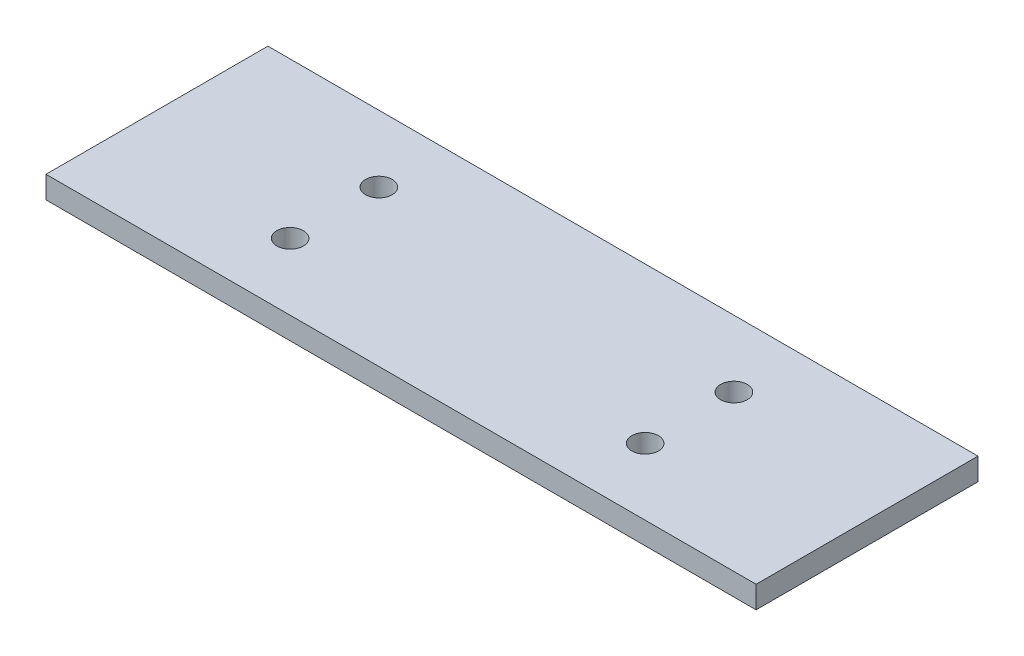
ISO-10303-21;
HEADER;
FILE_DESCRIPTION(('STEP AP214'),'2;1');
FILE_NAME('part.step','',(''),(''),'','','');
FILE_SCHEMA(('AUTOMOTIVE_DESIGN { 1 0 10303 214 1 1 1 1 }'));
ENDSEC;
DATA;
#1=APPLICATION_CONTEXT('core data for automotive mechanical design processes');
#2=APPLICATION_PROTOCOL_DEFINITION('international standard','automotive_design',2000,#1);
#3=PRODUCT_CONTEXT('',#1,'mechanical');
#4=PRODUCT('Part','Part','',(#3));
#5=PRODUCT_RELATED_PRODUCT_CATEGORY('part','',(#4));
#6=PRODUCT_DEFINITION_FORMATION('','',#4);
#7=PRODUCT_DEFINITION_CONTEXT('part definition',#1,'design');
#8=PRODUCT_DEFINITION('design','',#6,#7);
#9=PRODUCT_DEFINITION_SHAPE('','',#8);
#10=(LENGTH_UNIT() NAMED_UNIT(*) SI_UNIT(.MILLI.,.METRE.));
#11=(NAMED_UNIT(*) PLANE_ANGLE_UNIT() SI_UNIT($,.RADIAN.));
#12=(NAMED_UNIT(*) SI_UNIT($,.STERADIAN.) SOLID_ANGLE_UNIT());
#13=UNCERTAINTY_MEASURE_WITH_UNIT(LENGTH_MEASURE(1.E-05),#10,'distance_accuracy_value','');
#14=(GEOMETRIC_REPRESENTATION_CONTEXT(3) GLOBAL_UNCERTAINTY_ASSIGNED_CONTEXT((#13)) GLOBAL_UNIT_ASSIGNED_CONTEXT((#10,
#11,#12)) REPRESENTATION_CONTEXT('',''));
#15=CARTESIAN_POINT('',(0.,0.,0.));
#16=DIRECTION('',(0.,0.,1.));
#17=DIRECTION('',(1.,0.,0.));
#18=AXIS2_PLACEMENT_3D('',#15,#16,#17);
#19=CARTESIAN_POINT('',(0.,5.,0.));
#20=DIRECTION('',(0.,-1.,0.));
#21=DIRECTION('',(0.,0.,-1.));
#22=AXIS2_PLACEMENT_3D('',#19,#20,#21);
#23=PLANE('',#22);
#24=DIRECTION('',(0.,0.,-1.));
#25=VECTOR('',#24,1.);
#26=CARTESIAN_POINT('',(80.,5.,25.));
#27=LINE('',#26,#25);
#28=CARTESIAN_POINT('',(80.,5.,25.));
#29=VERTEX_POINT('',#28);
#30=CARTESIAN_POINT('',(80.,5.,-25.));
#31=VERTEX_POINT('',#30);
#32=EDGE_CURVE('E85',#29,#31,#27,.T.);
#33=ORIENTED_EDGE('',*,*,#32,.T.);
#34=DIRECTION('',(-1.,0.,0.));
#35=VECTOR('',#34,1.);
#36=CARTESIAN_POINT('',(-80.,5.,-25.));
#37=LINE('',#36,#35);
#38=CARTESIAN_POINT('',(-80.,5.,-25.));
#39=VERTEX_POINT('',#38);
#40=EDGE_CURVE('E80',#31,#39,#37,.T.);
#41=ORIENTED_EDGE('',*,*,#40,.T.);
#42=DIRECTION('',(0.,0.,1.));
#43=VECTOR('',#42,1.);
#44=CARTESIAN_POINT('',(-80.,5.,25.));
#45=LINE('',#44,#43);
#46=CARTESIAN_POINT('',(-80.,5.,25.));
#47=VERTEX_POINT('',#46);
#48=EDGE_CURVE('E83',#39,#47,#45,.T.);
#49=ORIENTED_EDGE('',*,*,#48,.T.);
#50=DIRECTION('',(1.,0.,0.));
#51=VECTOR('',#50,1.);
#52=CARTESIAN_POINT('',(-80.,5.,25.));
#53=LINE('',#52,#51);
#54=EDGE_CURVE('E50',#47,#29,#53,.T.);
#55=ORIENTED_EDGE('',*,*,#54,.T.);
#56=EDGE_LOOP('',(#33,#41,#49,#55));
#57=FACE_BOUND('',#56,.T.);
#58=CARTESIAN_POINT('',(-40.,5.,-9.99999999999999));
#59=DIRECTION('',(0.,1.,0.));
#60=DIRECTION('',(0.,0.,1.));
#61=AXIS2_PLACEMENT_3D('',#58,#59,#60);
#62=CIRCLE('',#61,3.00000000000001);
#63=CARTESIAN_POINT('',(-40.,5.,-6.99999999999999));
#64=VERTEX_POINT('',#63);
#65=EDGE_CURVE('E100',#64,#64,#62,.T.);
#66=ORIENTED_EDGE('',*,*,#65,.F.);
#67=EDGE_LOOP('',(#66));
#68=FACE_BOUND('',#67,.T.);
#69=CARTESIAN_POINT('',(-40.,5.,10.));
#70=DIRECTION('',(0.,1.,0.));
#71=DIRECTION('',(0.,0.,1.));
#72=AXIS2_PLACEMENT_3D('',#69,#70,#71);
#73=CIRCLE('',#72,3.00000000000001);
#74=CARTESIAN_POINT('',(-40.,5.,13.));
#75=VERTEX_POINT('',#74);
#76=EDGE_CURVE('E115',#75,#75,#73,.T.);
#77=ORIENTED_EDGE('',*,*,#76,.F.);
#78=EDGE_LOOP('',(#77));
#79=FACE_BOUND('',#78,.T.);
#80=CARTESIAN_POINT('',(40.,5.,-9.99999999999999));
#81=DIRECTION('',(0.,1.,0.));
#82=DIRECTION('',(0.,0.,1.));
#83=AXIS2_PLACEMENT_3D('',#80,#81,#82);
#84=CIRCLE('',#83,3.00000000000001);
#85=CARTESIAN_POINT('',(40.,5.,-6.99999999999998));
#86=VERTEX_POINT('',#85);
#87=EDGE_CURVE('E121',#86,#86,#84,.T.);
#88=ORIENTED_EDGE('',*,*,#87,.F.);
#89=EDGE_LOOP('',(#88));
#90=FACE_BOUND('',#89,.T.);
#91=CARTESIAN_POINT('',(40.,5.,10.));
#92=DIRECTION('',(0.,1.,0.));
#93=DIRECTION('',(0.,0.,1.));
#94=AXIS2_PLACEMENT_3D('',#91,#92,#93);
#95=CIRCLE('',#94,3.);
#96=CARTESIAN_POINT('',(40.,5.,13.));
#97=VERTEX_POINT('',#96);
#98=EDGE_CURVE('E127',#97,#97,#95,.T.);
#99=ORIENTED_EDGE('',*,*,#98,.F.);
#100=EDGE_LOOP('',(#99));
#101=FACE_BOUND('',#100,.T.);
#102=ADVANCED_FACE('F33',(#57,#68,#79,#90,#101),#23,.F.);
#103=CARTESIAN_POINT('',(0.,0.,0.));
#104=DIRECTION('',(0.,-1.,0.));
#105=DIRECTION('',(0.,0.,-1.));
#106=AXIS2_PLACEMENT_3D('',#103,#104,#105);
#107=PLANE('',#106);
#108=CARTESIAN_POINT('',(40.,0.,-9.99999999999999));
#109=DIRECTION('',(0.,1.,0.));
#110=DIRECTION('',(0.,0.,1.));
#111=AXIS2_PLACEMENT_3D('',#108,#109,#110);
#112=CIRCLE('',#111,3.00000000000001);
#113=CARTESIAN_POINT('',(40.,0.,-6.99999999999998));
#114=VERTEX_POINT('',#113);
#115=EDGE_CURVE('E124',#114,#114,#112,.T.);
#116=ORIENTED_EDGE('',*,*,#115,.T.);
#117=EDGE_LOOP('',(#116));
#118=FACE_BOUND('',#117,.T.);
#119=CARTESIAN_POINT('',(-40.,0.,-9.99999999999999));
#120=DIRECTION('',(0.,1.,0.));
#121=DIRECTION('',(0.,0.,1.));
#122=AXIS2_PLACEMENT_3D('',#119,#120,#121);
#123=CIRCLE('',#122,3.00000000000001);
#124=CARTESIAN_POINT('',(-40.,0.,-6.99999999999999));
#125=VERTEX_POINT('',#124);
#126=EDGE_CURVE('E112',#125,#125,#123,.T.);
#127=ORIENTED_EDGE('',*,*,#126,.T.);
#128=EDGE_LOOP('',(#127));
#129=FACE_BOUND('',#128,.T.);
#130=DIRECTION('',(0.,0.,-1.));
#131=VECTOR('',#130,1.);
#132=CARTESIAN_POINT('',(80.,0.,25.));
#133=LINE('',#132,#131);
#134=CARTESIAN_POINT('',(80.,0.,25.));
#135=VERTEX_POINT('',#134);
#136=CARTESIAN_POINT('',(80.,0.,-25.));
#137=VERTEX_POINT('',#136);
#138=EDGE_CURVE('E97',#135,#137,#133,.T.);
#139=ORIENTED_EDGE('',*,*,#138,.F.);
#140=DIRECTION('',(1.,0.,0.));
#141=VECTOR('',#140,1.);
#142=CARTESIAN_POINT('',(-80.,0.,25.));
#143=LINE('',#142,#141);
#144=CARTESIAN_POINT('',(-80.,0.,25.));
#145=VERTEX_POINT('',#144);
#146=EDGE_CURVE('E73',#145,#135,#143,.T.);
#147=ORIENTED_EDGE('',*,*,#146,.F.);
#148=DIRECTION('',(0.,0.,1.));
#149=VECTOR('',#148,1.);
#150=CARTESIAN_POINT('',(-80.,0.,25.));
#151=LINE('',#150,#149);
#152=CARTESIAN_POINT('',(-80.,0.,-25.));
#153=VERTEX_POINT('',#152);
#154=EDGE_CURVE('E67',#153,#145,#151,.T.);
#155=ORIENTED_EDGE('',*,*,#154,.F.);
#156=DIRECTION('',(-1.,0.,0.));
#157=VECTOR('',#156,1.);
#158=CARTESIAN_POINT('',(-80.,0.,-25.));
#159=LINE('',#158,#157);
#160=EDGE_CURVE('E89',#137,#153,#159,.T.);
#161=ORIENTED_EDGE('',*,*,#160,.F.);
#162=EDGE_LOOP('',(#139,#147,#155,#161));
#163=FACE_BOUND('',#162,.T.);
#164=CARTESIAN_POINT('',(-40.,0.,10.));
#165=DIRECTION('',(0.,1.,0.));
#166=DIRECTION('',(0.,0.,1.));
#167=AXIS2_PLACEMENT_3D('',#164,#165,#166);
#168=CIRCLE('',#167,3.00000000000001);
#169=CARTESIAN_POINT('',(-40.,0.,13.));
#170=VERTEX_POINT('',#169);
#171=EDGE_CURVE('E118',#170,#170,#168,.T.);
#172=ORIENTED_EDGE('',*,*,#171,.T.);
#173=EDGE_LOOP('',(#172));
#174=FACE_BOUND('',#173,.T.);
#175=CARTESIAN_POINT('',(40.,0.,10.));
#176=DIRECTION('',(0.,1.,0.));
#177=DIRECTION('',(0.,0.,1.));
#178=AXIS2_PLACEMENT_3D('',#175,#176,#177);
#179=CIRCLE('',#178,3.);
#180=CARTESIAN_POINT('',(40.,0.,13.));
#181=VERTEX_POINT('',#180);
#182=EDGE_CURVE('E130',#181,#181,#179,.T.);
#183=ORIENTED_EDGE('',*,*,#182,.T.);
#184=EDGE_LOOP('',(#183));
#185=FACE_BOUND('',#184,.T.);
#186=ADVANCED_FACE('F108',(#118,#129,#163,#174,#185),#107,.T.);
#187=CARTESIAN_POINT('',(80.,5.,25.));
#188=DIRECTION('',(-1.,0.,0.));
#189=DIRECTION('',(0.,0.,1.));
#190=AXIS2_PLACEMENT_3D('',#187,#188,#189);
#191=PLANE('',#190);
#192=ORIENTED_EDGE('',*,*,#138,.T.);
#193=DIRECTION('',(0.,-1.,0.));
#194=VECTOR('',#193,1.);
#195=CARTESIAN_POINT('',(80.,5.,-25.));
#196=LINE('',#195,#194);
#197=EDGE_CURVE('E11',#31,#137,#196,.T.);
#198=ORIENTED_EDGE('',*,*,#197,.F.);
#199=ORIENTED_EDGE('',*,*,#32,.F.);
#200=DIRECTION('',(0.,-1.,0.));
#201=VECTOR('',#200,1.);
#202=CARTESIAN_POINT('',(80.,5.,25.));
#203=LINE('',#202,#201);
#204=EDGE_CURVE('E93',#29,#135,#203,.T.);
#205=ORIENTED_EDGE('',*,*,#204,.T.);
#206=EDGE_LOOP('',(#192,#198,#199,#205));
#207=FACE_BOUND('',#206,.T.);
#208=ADVANCED_FACE('F35',(#207),#191,.F.);
#209=CARTESIAN_POINT('',(-80.,5.,-25.));
#210=DIRECTION('',(0.,0.,1.));
#211=DIRECTION('',(1.,0.,0.));
#212=AXIS2_PLACEMENT_3D('',#209,#210,#211);
#213=PLANE('',#212);
#214=ORIENTED_EDGE('',*,*,#160,.T.);
#215=DIRECTION('',(0.,-1.,0.));
#216=VECTOR('',#215,1.);
#217=CARTESIAN_POINT('',(-80.,5.,-25.));
#218=LINE('',#217,#216);
#219=EDGE_CURVE('E42',#39,#153,#218,.T.);
#220=ORIENTED_EDGE('',*,*,#219,.F.);
#221=ORIENTED_EDGE('',*,*,#40,.F.);
#222=ORIENTED_EDGE('',*,*,#197,.T.);
#223=EDGE_LOOP('',(#214,#220,#221,#222));
#224=FACE_BOUND('',#223,.T.);
#225=ADVANCED_FACE('F88',(#224),#213,.F.);
#226=CARTESIAN_POINT('',(-80.,5.,25.));
#227=DIRECTION('',(1.,0.,0.));
#228=DIRECTION('',(0.,0.,-1.));
#229=AXIS2_PLACEMENT_3D('',#226,#227,#228);
#230=PLANE('',#229);
#231=ORIENTED_EDGE('',*,*,#154,.T.);
#232=DIRECTION('',(0.,-1.,0.));
#233=VECTOR('',#232,1.);
#234=CARTESIAN_POINT('',(-80.,5.,25.));
#235=LINE('',#234,#233);
#236=EDGE_CURVE('E90',#47,#145,#235,.T.);
#237=ORIENTED_EDGE('',*,*,#236,.F.);
#238=ORIENTED_EDGE('',*,*,#48,.F.);
#239=ORIENTED_EDGE('',*,*,#219,.T.);
#240=EDGE_LOOP('',(#231,#237,#238,#239));
#241=FACE_BOUND('',#240,.T.);
#242=ADVANCED_FACE('F91',(#241),#230,.F.);
#243=CARTESIAN_POINT('',(-80.,5.,25.));
#244=DIRECTION('',(0.,0.,-1.));
#245=DIRECTION('',(-1.,0.,0.));
#246=AXIS2_PLACEMENT_3D('',#243,#244,#245);
#247=PLANE('',#246);
#248=ORIENTED_EDGE('',*,*,#146,.T.);
#249=ORIENTED_EDGE('',*,*,#204,.F.);
#250=ORIENTED_EDGE('',*,*,#54,.F.);
#251=ORIENTED_EDGE('',*,*,#236,.T.);
#252=EDGE_LOOP('',(#248,#249,#250,#251));
#253=FACE_BOUND('',#252,.T.);
#254=ADVANCED_FACE('F105',(#253),#247,.F.);
#255=CARTESIAN_POINT('',(-40.,5.,-9.99999999999999));
#256=DIRECTION('',(0.,-1.,0.));
#257=DIRECTION('',(0.,0.,-1.));
#258=AXIS2_PLACEMENT_3D('',#255,#256,#257);
#259=CYLINDRICAL_SURFACE('',#258,3.00000000000001);
#260=ORIENTED_EDGE('',*,*,#65,.T.);
#261=EDGE_LOOP('',(#260));
#262=FACE_BOUND('',#261,.T.);
#263=ORIENTED_EDGE('',*,*,#126,.F.);
#264=EDGE_LOOP('',(#263));
#265=FACE_BOUND('',#264,.T.);
#266=ADVANCED_FACE('F147',(#262,#265),#259,.F.);
#267=CARTESIAN_POINT('',(-40.,5.,10.));
#268=DIRECTION('',(0.,-1.,0.));
#269=DIRECTION('',(0.,0.,-1.));
#270=AXIS2_PLACEMENT_3D('',#267,#268,#269);
#271=CYLINDRICAL_SURFACE('',#270,3.00000000000001);
#272=ORIENTED_EDGE('',*,*,#76,.T.);
#273=EDGE_LOOP('',(#272));
#274=FACE_BOUND('',#273,.T.);
#275=ORIENTED_EDGE('',*,*,#171,.F.);
#276=EDGE_LOOP('',(#275));
#277=FACE_BOUND('',#276,.T.);
#278=ADVANCED_FACE('F193',(#274,#277),#271,.F.);
#279=CARTESIAN_POINT('',(40.,5.,-9.99999999999999));
#280=DIRECTION('',(0.,-1.,0.));
#281=DIRECTION('',(0.,0.,-1.));
#282=AXIS2_PLACEMENT_3D('',#279,#280,#281);
#283=CYLINDRICAL_SURFACE('',#282,3.00000000000001);
#284=ORIENTED_EDGE('',*,*,#87,.T.);
#285=EDGE_LOOP('',(#284));
#286=FACE_BOUND('',#285,.T.);
#287=ORIENTED_EDGE('',*,*,#115,.F.);
#288=EDGE_LOOP('',(#287));
#289=FACE_BOUND('',#288,.T.);
#290=ADVANCED_FACE('F201',(#286,#289),#283,.F.);
#291=CARTESIAN_POINT('',(40.,5.,10.));
#292=DIRECTION('',(0.,-1.,0.));
#293=DIRECTION('',(0.,0.,-1.));
#294=AXIS2_PLACEMENT_3D('',#291,#292,#293);
#295=CYLINDRICAL_SURFACE('',#294,3.);
#296=ORIENTED_EDGE('',*,*,#98,.T.);
#297=EDGE_LOOP('',(#296));
#298=FACE_BOUND('',#297,.T.);
#299=ORIENTED_EDGE('',*,*,#182,.F.);
#300=EDGE_LOOP('',(#299));
#301=FACE_BOUND('',#300,.T.);
#302=ADVANCED_FACE('F136',(#298,#301),#295,.F.);
#303=CLOSED_SHELL('',(#102,#186,#208,#225,#242,#254,#266,#278,#290,#302));
#304=MANIFOLD_SOLID_BREP('B2',#303);
#305=ADVANCED_BREP_SHAPE_REPRESENTATION('',(#18,#304),#14);
#306=SHAPE_DEFINITION_REPRESENTATION(#9,#305);
ENDSEC;
END-ISO-10303-21;
